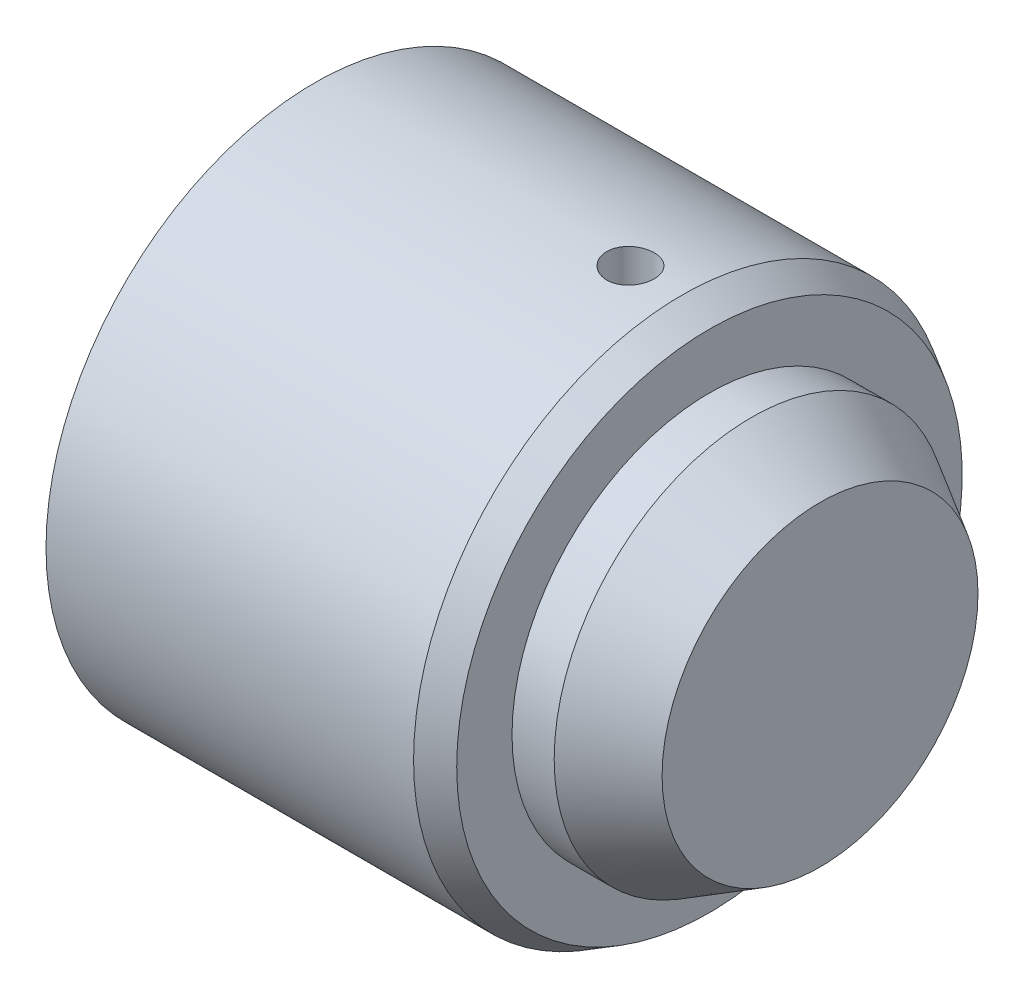
ISO-10303-21;
HEADER;
FILE_DESCRIPTION(('STEP AP214'),'2;1');
FILE_NAME('part.step','',(''),(''),'','','');
FILE_SCHEMA(('AUTOMOTIVE_DESIGN { 1 0 10303 214 1 1 1 1 }'));
ENDSEC;
DATA;
#1=APPLICATION_CONTEXT('core data for automotive mechanical design processes');
#2=APPLICATION_PROTOCOL_DEFINITION('international standard','automotive_design',2000,#1);
#3=PRODUCT_CONTEXT('',#1,'mechanical');
#4=PRODUCT('Part','Part','',(#3));
#5=PRODUCT_RELATED_PRODUCT_CATEGORY('part','',(#4));
#6=PRODUCT_DEFINITION_FORMATION('','',#4);
#7=PRODUCT_DEFINITION_CONTEXT('part definition',#1,'design');
#8=PRODUCT_DEFINITION('design','',#6,#7);
#9=PRODUCT_DEFINITION_SHAPE('','',#8);
#10=(LENGTH_UNIT() NAMED_UNIT(*) SI_UNIT(.MILLI.,.METRE.));
#11=(NAMED_UNIT(*) PLANE_ANGLE_UNIT() SI_UNIT($,.RADIAN.));
#12=(NAMED_UNIT(*) SI_UNIT($,.STERADIAN.) SOLID_ANGLE_UNIT());
#13=UNCERTAINTY_MEASURE_WITH_UNIT(LENGTH_MEASURE(1.E-05),#10,'distance_accuracy_value','');
#14=(GEOMETRIC_REPRESENTATION_CONTEXT(3) GLOBAL_UNCERTAINTY_ASSIGNED_CONTEXT((#13)) GLOBAL_UNIT_ASSIGNED_CONTEXT((#10,
#11,#12)) REPRESENTATION_CONTEXT('',''));
#15=CARTESIAN_POINT('',(0.,0.,0.));
#16=DIRECTION('',(0.,0.,1.));
#17=DIRECTION('',(1.,0.,0.));
#18=AXIS2_PLACEMENT_3D('',#15,#16,#17);
#19=CARTESIAN_POINT('',(0.,0.,0.));
#20=DIRECTION('',(-1.,0.,0.));
#21=DIRECTION('',(0.,0.,1.));
#22=AXIS2_PLACEMENT_3D('',#19,#20,#21);
#23=PLANE('',#22);
#24=CARTESIAN_POINT('',(0.,0.,0.));
#25=DIRECTION('',(-1.,0.,0.));
#26=DIRECTION('',(0.,0.,1.));
#27=AXIS2_PLACEMENT_3D('',#24,#25,#26);
#28=CIRCLE('',#27,9.99999999999999);
#29=CARTESIAN_POINT('',(0.,0.,9.99999999999999));
#30=VERTEX_POINT('',#29);
#31=EDGE_CURVE('E104',#30,#30,#28,.F.);
#32=ORIENTED_EDGE('',*,*,#31,.T.);
#33=EDGE_LOOP('',(#32));
#34=FACE_BOUND('',#33,.T.);
#35=ADVANCED_FACE('F47',(#34),#23,.F.);
#36=CARTESIAN_POINT('',(-10.,0.,0.));
#37=DIRECTION('',(-1.,0.,0.));
#38=DIRECTION('',(0.,0.,1.));
#39=AXIS2_PLACEMENT_3D('',#36,#37,#38);
#40=CYLINDRICAL_SURFACE('',#39,12.5);
#41=CARTESIAN_POINT('',(-4.3301270189222,0.,0.));
#42=DIRECTION('',(-1.,0.,0.));
#43=DIRECTION('',(0.,0.,1.));
#44=AXIS2_PLACEMENT_3D('',#41,#42,#43);
#45=CIRCLE('',#44,12.5);
#46=CARTESIAN_POINT('',(-4.3301270189222,0.,12.5));
#47=VERTEX_POINT('',#46);
#48=EDGE_CURVE('E100',#47,#47,#45,.T.);
#49=ORIENTED_EDGE('',*,*,#48,.T.);
#50=EDGE_LOOP('',(#49));
#51=FACE_BOUND('',#50,.T.);
#52=CARTESIAN_POINT('',(-7.,0.,0.));
#53=DIRECTION('',(-1.,0.,0.));
#54=DIRECTION('',(0.,0.,1.));
#55=AXIS2_PLACEMENT_3D('',#52,#53,#54);
#56=CIRCLE('',#55,12.5);
#57=CARTESIAN_POINT('',(-7.,0.,12.5));
#58=VERTEX_POINT('',#57);
#59=EDGE_CURVE('E96',#58,#58,#56,.T.);
#60=ORIENTED_EDGE('',*,*,#59,.F.);
#61=EDGE_LOOP('',(#60));
#62=FACE_BOUND('',#61,.T.);
#63=ADVANCED_FACE('F154',(#51,#62),#40,.T.);
#64=CARTESIAN_POINT('',(-7.,12.5,0.));
#65=DIRECTION('',(-1.,0.,0.));
#66=DIRECTION('',(0.,0.,1.));
#67=AXIS2_PLACEMENT_3D('',#64,#65,#66);
#68=PLANE('',#67);
#69=CARTESIAN_POINT('',(-7.,0.,0.));
#70=DIRECTION('',(-1.,0.,0.));
#71=DIRECTION('',(0.,0.,1.));
#72=AXIS2_PLACEMENT_3D('',#69,#70,#71);
#73=CIRCLE('',#72,16.);
#74=CARTESIAN_POINT('',(-7.,0.,16.));
#75=VERTEX_POINT('',#74);
#76=EDGE_CURVE('E11',#75,#75,#73,.F.);
#77=ORIENTED_EDGE('',*,*,#76,.T.);
#78=EDGE_LOOP('',(#77));
#79=FACE_BOUND('',#78,.T.);
#80=ORIENTED_EDGE('',*,*,#59,.T.);
#81=EDGE_LOOP('',(#80));
#82=FACE_BOUND('',#81,.T.);
#83=ADVANCED_FACE('F149',(#79,#82),#68,.F.);
#84=CARTESIAN_POINT('',(-10.,0.,0.));
#85=DIRECTION('',(-1.,0.,0.));
#86=DIRECTION('',(0.,0.,1.));
#87=AXIS2_PLACEMENT_3D('',#84,#85,#86);
#88=CYLINDRICAL_SURFACE('',#87,17.);
#89=CARTESIAN_POINT('',(-12.,-16.9336942218761,1.5));
#90=CARTESIAN_POINT('',(-11.9159204825132,-16.9336950978004,1.49999633516772));
#91=CARTESIAN_POINT('',(-11.8317841778896,-16.9343271753964,1.49290684455629));
#92=CARTESIAN_POINT('',(-11.6658408210362,-16.9367870765352,1.46473062205643));
#93=CARTESIAN_POINT('',(-11.5840364961547,-16.9386162447077,1.44362814972226));
#94=CARTESIAN_POINT('',(-11.4251844522875,-16.9432615534383,1.3880421836027));
#95=CARTESIAN_POINT('',(-11.3481340149467,-16.9460771236862,1.35356642064934));
#96=CARTESIAN_POINT('',(-11.2009314140911,-16.9523772825804,1.27222657776627));
#97=CARTESIAN_POINT('',(-11.130777808918,-16.9558617309584,1.22536509443389));
#98=CARTESIAN_POINT('',(-10.9991416592004,-16.9631182231717,1.12043942591989));
#99=CARTESIAN_POINT('',(-10.9376815889941,-16.9668909749368,1.06234709155776));
#100=CARTESIAN_POINT('',(-10.8253703478861,-16.9742925141895,0.936668506914025));
#101=CARTESIAN_POINT('',(-10.7745196464366,-16.9779212953008,0.869081836740363));
#102=CARTESIAN_POINT('',(-10.6847948890886,-16.9846328283164,0.726197884312478));
#103=CARTESIAN_POINT('',(-10.6459404248648,-16.9877146835546,0.650888253654693));
#104=CARTESIAN_POINT('',(-10.5814363959711,-16.9929774708925,0.494782164211972));
#105=CARTESIAN_POINT('',(-10.5557865752385,-16.9951584204621,0.413985811859216));
#106=CARTESIAN_POINT('',(-10.5184850320794,-16.9983687081508,0.249424635325278));
#107=CARTESIAN_POINT('',(-10.5067967619858,-16.9994010525277,0.165668155079528));
#108=CARTESIAN_POINT('',(-10.4976370971062,-17.0002080114694,-0.00262369655283038));
#109=CARTESIAN_POINT('',(-10.5001654092043,-16.9999826519653,-0.0871590518448078));
#110=CARTESIAN_POINT('',(-10.5193373116254,-16.9983020697412,-0.254361112055097));
#111=CARTESIAN_POINT('',(-10.5359416011779,-16.996850271334,-0.33703236253217));
#112=CARTESIAN_POINT('',(-10.5827329823663,-16.9928840047154,-0.49840994217289));
#113=CARTESIAN_POINT('',(-10.6129202164291,-16.990369525361,-0.57711622975143));
#114=CARTESIAN_POINT('',(-10.6860641877804,-16.9845548345853,-0.728454436682548));
#115=CARTESIAN_POINT('',(-10.7290384683139,-16.9812535449424,-0.801077834022927));
#116=CARTESIAN_POINT('',(-10.8265239130691,-16.9742360741871,-0.938095742336102));
#117=CARTESIAN_POINT('',(-10.8810353400728,-16.9705198836253,-1.00249006582142));
#118=CARTESIAN_POINT('',(-11.0002690703821,-16.963075136917,-1.12145180709538));
#119=CARTESIAN_POINT('',(-11.0650255341855,-16.9593465817836,-1.17598499215033));
#120=CARTESIAN_POINT('',(-11.202792260004,-16.9523100454116,-1.27341183275852));
#121=CARTESIAN_POINT('',(-11.2758025300812,-16.9490020645838,-1.31630547694248));
#122=CARTESIAN_POINT('',(-11.4280290363941,-16.9431807009154,-1.38923465249915));
#123=CARTESIAN_POINT('',(-11.5072461730093,-16.9406674336247,-1.41926831427872));
#124=CARTESIAN_POINT('',(-11.6696258401683,-16.9367223668568,-1.46559915535104));
#125=CARTESIAN_POINT('',(-11.752788277515,-16.935290541847,-1.48189665895332));
#126=CARTESIAN_POINT('',(-11.9203980496509,-16.9336747078646,-1.50024902886287));
#127=CARTESIAN_POINT('',(-12.0048401140938,-16.9334865128484,-1.50235167540466));
#128=CARTESIAN_POINT('',(-12.1728754801241,-16.9343681999185,-1.49237989312936));
#129=CARTESIAN_POINT('',(-12.2564687905934,-16.935438068826,-1.48030561282259));
#130=CARTESIAN_POINT('',(-12.4202959936884,-16.9387115230059,-1.44236259353404));
#131=CARTESIAN_POINT('',(-12.5005351092375,-16.9409132688319,-1.41651623348173));
#132=CARTESIAN_POINT('',(-12.6555381718845,-16.9462008815372,-1.35178551464609));
#133=CARTESIAN_POINT('',(-12.7303020206761,-16.9492867642858,-1.31290092183672));
#134=CARTESIAN_POINT('',(-12.8724506874699,-16.9560050965297,-1.22307695789039));
#135=CARTESIAN_POINT('',(-12.9398153481048,-16.9596389780679,-1.17210579595232));
#136=CARTESIAN_POINT('',(-13.0650494881695,-16.9670390646845,-1.05960139547773));
#137=CARTESIAN_POINT('',(-13.122918784518,-16.9708052723126,-0.998067953335507));
#138=CARTESIAN_POINT('',(-13.2276830521384,-16.9780581685734,-0.865979004018037));
#139=CARTESIAN_POINT('',(-13.2745469445675,-16.9815440477653,-0.795398796569824));
#140=CARTESIAN_POINT('',(-13.3557566972373,-16.987831825963,-0.647342605038226));
#141=CARTESIAN_POINT('',(-13.3901026955234,-16.9906337325116,-0.569866697011302));
#142=CARTESIAN_POINT('',(-13.4452485253189,-16.9952341622274,-0.410328930966409));
#143=CARTESIAN_POINT('',(-13.4660674519345,-16.9970340992797,-0.328273715780132));
#144=CARTESIAN_POINT('',(-13.4936305505454,-16.9994335446732,-0.161815800666716));
#145=CARTESIAN_POINT('',(-13.5003750244516,-17.0000330787642,-0.0774131511337259));
#146=CARTESIAN_POINT('',(-13.4995940507413,-16.999964192552,0.0910377060386938));
#147=CARTESIAN_POINT('',(-13.4921169855256,-16.9993000712658,0.175086143969796));
#148=CARTESIAN_POINT('',(-13.4632062287244,-16.996786987409,0.340728453841884));
#149=CARTESIAN_POINT('',(-13.4417725201503,-16.9949380233962,0.422322322794937));
#150=CARTESIAN_POINT('',(-13.3855695166058,-16.990262623238,0.580741487336431));
#151=CARTESIAN_POINT('',(-13.3508012480439,-16.987436262328,0.657567149422048));
#152=CARTESIAN_POINT('',(-13.2689214734468,-16.9811219517135,0.804299076503763));
#153=CARTESIAN_POINT('',(-13.2218101284836,-16.9776340106426,0.874205431777546));
#154=CARTESIAN_POINT('',(-13.1163998279913,-16.9703736749572,1.00536214502652));
#155=CARTESIAN_POINT('',(-13.0580649796898,-16.9666003919726,1.06658360696092));
#156=CARTESIAN_POINT('',(-12.9319305607873,-16.9592022110052,1.17839250623034));
#157=CARTESIAN_POINT('',(-12.8641287074667,-16.9555773490836,1.22897737143577));
#158=CARTESIAN_POINT('',(-12.720837863555,-16.9488783909142,1.31815454706369));
#159=CARTESIAN_POINT('',(-12.645333364193,-16.9458054416475,1.35672200240458));
#160=CARTESIAN_POINT('',(-12.4889437300891,-16.9405721242147,1.42058163606436));
#161=CARTESIAN_POINT('',(-12.4080648692797,-16.9384107128703,1.44588899753132));
#162=CARTESIAN_POINT('',(-12.2722616773835,-16.9357981080893,1.47610149832787));
#163=CARTESIAN_POINT('',(-12.2182093989146,-16.9350128060831,1.48505143183308));
#164=CARTESIAN_POINT('',(-12.1094461008919,-16.9339605786653,1.4970018663906));
#165=CARTESIAN_POINT('',(-12.0547350833686,-16.9336936516565,1.50000238577607));
#166=CARTESIAN_POINT('',(-12.,-16.9336942218761,1.5));
#167=B_SPLINE_CURVE_WITH_KNOTS('',3,(#89,#90,#91,#92,#93,#94,#95,#96,#97,#98,#99,#100,#101,#102,
#103,#104,#105,#106,#107,#108,#109,#110,#111,#112,#113,#114,#115,#116,#117,#118,#119,#120,#121,
#122,#123,#124,#125,#126,#127,#128,#129,#130,#131,#132,#133,#134,#135,#136,#137,#138,#139,#140,
#141,#142,#143,#144,#145,#146,#147,#148,#149,#150,#151,#152,#153,#154,#155,#156,#157,#158,#159,
#160,#161,#162,#163,#164,#165,#166),.UNSPECIFIED.,.T.,.F.,(4,2,2,2,2,2,2,2,2,2,2,2,2,2,2,2,2,2,
2,2,2,2,2,2,2,2,2,2,2,2,2,2,2,2,2,2,2,2,4),(0.,0.252038695018247,0.504360979031312,
0.756537617428056,1.00866143027265,1.26142556055625,1.51420087298959,1.76738684845994,
2.02056791399618,2.27308475540121,2.52559639046295,2.77740531479011,3.02921687957624,
3.28137552389821,3.53353991226425,3.78656354750224,4.03958742988799,4.2926480845817,
4.54570276436764,4.79790522937579,5.050105052462,5.30189630784819,5.55369208293146,
5.8061576395068,6.05862806332691,6.31180310345513,6.56497535152301,6.81778943524099,
7.0705980957909,7.32254822648263,7.57449866385936,7.82642971160526,8.07835747191914,
8.33110470711196,8.58391299124039,8.83724072926354,9.09027776311014,9.25435341324418,
9.41842855777743),.UNSPECIFIED.);
#168=CARTESIAN_POINT('',(-12.,-16.9336942218761,1.5));
#169=VERTEX_POINT('',#168);
#170=EDGE_CURVE('E140',#169,#169,#167,.T.);
#171=ORIENTED_EDGE('',*,*,#170,.T.);
#172=EDGE_LOOP('',(#171));
#173=FACE_BOUND('',#172,.T.);
#174=CARTESIAN_POINT('',(-12.,16.9336942218761,1.5));
#175=CARTESIAN_POINT('',(-12.0840795174868,16.9336950978004,1.49999633516772));
#176=CARTESIAN_POINT('',(-12.1682158221104,16.9343271753964,1.49290684455629));
#177=CARTESIAN_POINT('',(-12.3341591789638,16.9367870765352,1.46473062205643));
#178=CARTESIAN_POINT('',(-12.4159635038453,16.9386162447077,1.44362814972226));
#179=CARTESIAN_POINT('',(-12.5748155477125,16.9432615534383,1.3880421836027));
#180=CARTESIAN_POINT('',(-12.6518659850533,16.9460771236862,1.35356642064934));
#181=CARTESIAN_POINT('',(-12.7990685859089,16.9523772825804,1.27222657776627));
#182=CARTESIAN_POINT('',(-12.869222191082,16.9558617309584,1.22536509443389));
#183=CARTESIAN_POINT('',(-13.0008583407996,16.9631182231717,1.12043942591989));
#184=CARTESIAN_POINT('',(-13.0623184110059,16.9668909749368,1.06234709155776));
#185=CARTESIAN_POINT('',(-13.1746296521139,16.9742925141895,0.936668506914025));
#186=CARTESIAN_POINT('',(-13.2254803535634,16.9779212953008,0.869081836740362));
#187=CARTESIAN_POINT('',(-13.3152051109114,16.9846328283164,0.726197884312478));
#188=CARTESIAN_POINT('',(-13.3540595751352,16.9877146835546,0.650888253654693));
#189=CARTESIAN_POINT('',(-13.4185636040289,16.9929774708925,0.494782164211971));
#190=CARTESIAN_POINT('',(-13.4442134247615,16.9951584204621,0.413985811859216));
#191=CARTESIAN_POINT('',(-13.4815149679206,16.9983687081508,0.249424635325278));
#192=CARTESIAN_POINT('',(-13.4932032380142,16.9994010525277,0.165668155079528));
#193=CARTESIAN_POINT('',(-13.5023629028938,17.0002080114694,-0.00262369655283038));
#194=CARTESIAN_POINT('',(-13.4998345907957,16.9999826519653,-0.0871590518448078));
#195=CARTESIAN_POINT('',(-13.4806626883746,16.9983020697412,-0.254361112055097));
#196=CARTESIAN_POINT('',(-13.4640583988221,16.996850271334,-0.33703236253217));
#197=CARTESIAN_POINT('',(-13.4172670176337,16.9928840047154,-0.49840994217289));
#198=CARTESIAN_POINT('',(-13.3870797835709,16.990369525361,-0.57711622975143));
#199=CARTESIAN_POINT('',(-13.3139358122196,16.9845548345853,-0.728454436682548));
#200=CARTESIAN_POINT('',(-13.2709615316861,16.9812535449424,-0.801077834022927));
#201=CARTESIAN_POINT('',(-13.1734760869309,16.9742360741871,-0.938095742336102));
#202=CARTESIAN_POINT('',(-13.1189646599272,16.9705198836253,-1.00249006582142));
#203=CARTESIAN_POINT('',(-12.9997309296179,16.963075136917,-1.12145180709538));
#204=CARTESIAN_POINT('',(-12.9349744658145,16.9593465817836,-1.17598499215033));
#205=CARTESIAN_POINT('',(-12.797207739996,16.9523100454116,-1.27341183275852));
#206=CARTESIAN_POINT('',(-12.7241974699188,16.9490020645838,-1.31630547694248));
#207=CARTESIAN_POINT('',(-12.5719709636059,16.9431807009154,-1.38923465249915));
#208=CARTESIAN_POINT('',(-12.4927538269907,16.9406674336247,-1.41926831427872));
#209=CARTESIAN_POINT('',(-12.3303741598317,16.9367223668568,-1.46559915535104));
#210=CARTESIAN_POINT('',(-12.247211722485,16.935290541847,-1.48189665895332));
#211=CARTESIAN_POINT('',(-12.0796019503491,16.9336747078646,-1.50024902886287));
#212=CARTESIAN_POINT('',(-11.9951598859062,16.9334865128484,-1.50235167540466));
#213=CARTESIAN_POINT('',(-11.8271245198759,16.9343681999185,-1.49237989312936));
#214=CARTESIAN_POINT('',(-11.7435312094066,16.935438068826,-1.48030561282259));
#215=CARTESIAN_POINT('',(-11.5797040063116,16.9387115230059,-1.44236259353404));
#216=CARTESIAN_POINT('',(-11.4994648907625,16.9409132688319,-1.41651623348173));
#217=CARTESIAN_POINT('',(-11.3444618281155,16.9462008815372,-1.35178551464609));
#218=CARTESIAN_POINT('',(-11.2696979793239,16.9492867642858,-1.31290092183672));
#219=CARTESIAN_POINT('',(-11.1275493125301,16.9560050965297,-1.22307695789039));
#220=CARTESIAN_POINT('',(-11.0601846518952,16.9596389780679,-1.17210579595232));
#221=CARTESIAN_POINT('',(-10.9349505118305,16.9670390646845,-1.05960139547773));
#222=CARTESIAN_POINT('',(-10.877081215482,16.9708052723126,-0.998067953335507));
#223=CARTESIAN_POINT('',(-10.7723169478616,16.9780581685734,-0.865979004018037));
#224=CARTESIAN_POINT('',(-10.7254530554325,16.9815440477653,-0.795398796569824));
#225=CARTESIAN_POINT('',(-10.6442433027627,16.987831825963,-0.647342605038226));
#226=CARTESIAN_POINT('',(-10.6098973044766,16.9906337325116,-0.569866697011302));
#227=CARTESIAN_POINT('',(-10.5547514746811,16.9952341622274,-0.410328930966409));
#228=CARTESIAN_POINT('',(-10.5339325480655,16.9970340992797,-0.328273715780132));
#229=CARTESIAN_POINT('',(-10.5063694494546,16.9994335446732,-0.161815800666716));
#230=CARTESIAN_POINT('',(-10.4996249755484,17.0000330787642,-0.0774131511337259));
#231=CARTESIAN_POINT('',(-10.5004059492587,16.999964192552,0.0910377060386938));
#232=CARTESIAN_POINT('',(-10.5078830144744,16.9993000712658,0.175086143969796));
#233=CARTESIAN_POINT('',(-10.5367937712756,16.996786987409,0.340728453841884));
#234=CARTESIAN_POINT('',(-10.5582274798497,16.9949380233962,0.422322322794937));
#235=CARTESIAN_POINT('',(-10.6144304833942,16.990262623238,0.580741487336431));
#236=CARTESIAN_POINT('',(-10.6491987519561,16.987436262328,0.657567149422048));
#237=CARTESIAN_POINT('',(-10.7310785265532,16.9811219517135,0.804299076503763));
#238=CARTESIAN_POINT('',(-10.7781898715164,16.9776340106426,0.874205431777546));
#239=CARTESIAN_POINT('',(-10.8836001720087,16.9703736749572,1.00536214502652));
#240=CARTESIAN_POINT('',(-10.9419350203102,16.9666003919726,1.06658360696092));
#241=CARTESIAN_POINT('',(-11.0680694392127,16.9592022110052,1.17839250623034));
#242=CARTESIAN_POINT('',(-11.1358712925333,16.9555773490836,1.22897737143577));
#243=CARTESIAN_POINT('',(-11.279162136445,16.9488783909142,1.31815454706369));
#244=CARTESIAN_POINT('',(-11.354666635807,16.9458054416475,1.35672200240458));
#245=CARTESIAN_POINT('',(-11.5110562699109,16.9405721242147,1.42058163606436));
#246=CARTESIAN_POINT('',(-11.5919351307203,16.9384107128703,1.44588899753132));
#247=CARTESIAN_POINT('',(-11.7277383226165,16.9357981080893,1.47610149832787));
#248=CARTESIAN_POINT('',(-11.7817906010854,16.9350128060831,1.48505143183308));
#249=CARTESIAN_POINT('',(-11.8905538991081,16.9339605786653,1.4970018663906));
#250=CARTESIAN_POINT('',(-11.9452649166314,16.9336936516565,1.50000238577607));
#251=CARTESIAN_POINT('',(-12.,16.9336942218761,1.5));
#252=B_SPLINE_CURVE_WITH_KNOTS('',3,(#174,#175,#176,#177,#178,#179,#180,#181,#182,#183,#184,
#185,#186,#187,#188,#189,#190,#191,#192,#193,#194,#195,#196,#197,#198,#199,#200,#201,#202,#203,
#204,#205,#206,#207,#208,#209,#210,#211,#212,#213,#214,#215,#216,#217,#218,#219,#220,#221,#222,
#223,#224,#225,#226,#227,#228,#229,#230,#231,#232,#233,#234,#235,#236,#237,#238,#239,#240,#241,
#242,#243,#244,#245,#246,#247,#248,#249,#250,#251),.UNSPECIFIED.,.T.,.F.,(4,2,2,2,2,2,2,2,2,2,2,
2,2,2,2,2,2,2,2,2,2,2,2,2,2,2,2,2,2,2,2,2,2,2,2,2,2,2,4),(0.,0.252038695018247,
0.504360979031312,0.756537617428056,1.00866143027265,1.26142556055625,1.51420087298959,
1.76738684845994,2.02056791399618,2.27308475540121,2.52559639046295,2.77740531479011,
3.02921687957624,3.28137552389821,3.53353991226425,3.78656354750224,4.03958742988799,
4.2926480845817,4.54570276436764,4.79790522937579,5.050105052462,5.30189630784819,
5.55369208293146,5.8061576395068,6.05862806332691,6.31180310345513,6.56497535152301,
6.81778943524099,7.0705980957909,7.32254822648263,7.57449866385936,7.82642971160526,
8.07835747191914,8.33110470711196,8.58391299124039,8.83724072926354,9.09027776311014,
9.25435341324418,9.41842855777743),.UNSPECIFIED.);
#253=CARTESIAN_POINT('',(-12.,16.9336942218761,1.5));
#254=VERTEX_POINT('',#253);
#255=EDGE_CURVE('E133',#254,#254,#252,.T.);
#256=ORIENTED_EDGE('',*,*,#255,.T.);
#257=EDGE_LOOP('',(#256));
#258=FACE_BOUND('',#257,.T.);
#259=CARTESIAN_POINT('',(-8.73205080756888,0.,0.));
#260=DIRECTION('',(-1.,0.,0.));
#261=DIRECTION('',(0.,0.,1.));
#262=AXIS2_PLACEMENT_3D('',#259,#260,#261);
#263=CIRCLE('',#262,17.);
#264=CARTESIAN_POINT('',(-8.73205080756888,0.,17.));
#265=VERTEX_POINT('',#264);
#266=EDGE_CURVE('E62',#265,#265,#263,.T.);
#267=ORIENTED_EDGE('',*,*,#266,.T.);
#268=EDGE_LOOP('',(#267));
#269=FACE_BOUND('',#268,.T.);
#270=CARTESIAN_POINT('',(-32.,0.,0.));
#271=DIRECTION('',(-1.,0.,0.));
#272=DIRECTION('',(0.,0.,1.));
#273=AXIS2_PLACEMENT_3D('',#270,#271,#272);
#274=CIRCLE('',#273,17.);
#275=CARTESIAN_POINT('',(-32.,0.,17.));
#276=VERTEX_POINT('',#275);
#277=EDGE_CURVE('E92',#276,#276,#274,.T.);
#278=ORIENTED_EDGE('',*,*,#277,.F.);
#279=EDGE_LOOP('',(#278));
#280=FACE_BOUND('',#279,.T.);
#281=ADVANCED_FACE('F144',(#173,#258,#269,#280),#88,.T.);
#282=CARTESIAN_POINT('',(-32.,17.,0.));
#283=DIRECTION('',(1.,0.,0.));
#284=DIRECTION('',(0.,0.,-1.));
#285=AXIS2_PLACEMENT_3D('',#282,#283,#284);
#286=PLANE('',#285);
#287=CARTESIAN_POINT('',(-32.,0.,0.));
#288=DIRECTION('',(-1.,0.,0.));
#289=DIRECTION('',(0.,0.,1.));
#290=AXIS2_PLACEMENT_3D('',#287,#288,#289);
#291=CIRCLE('',#290,14.);
#292=CARTESIAN_POINT('',(-32.,0.,14.));
#293=VERTEX_POINT('',#292);
#294=EDGE_CURVE('E82',#293,#293,#291,.T.);
#295=ORIENTED_EDGE('',*,*,#294,.F.);
#296=EDGE_LOOP('',(#295));
#297=FACE_BOUND('',#296,.T.);
#298=ORIENTED_EDGE('',*,*,#277,.T.);
#299=EDGE_LOOP('',(#298));
#300=FACE_BOUND('',#299,.T.);
#301=ADVANCED_FACE('F148',(#297,#300),#286,.F.);
#302=CARTESIAN_POINT('',(-10.,0.,0.));
#303=DIRECTION('',(-1.,0.,0.));
#304=DIRECTION('',(0.,0.,1.));
#305=AXIS2_PLACEMENT_3D('',#302,#303,#304);
#306=CYLINDRICAL_SURFACE('',#305,14.);
#307=CARTESIAN_POINT('',(-12.,-13.9194109070751,1.5));
#308=CARTESIAN_POINT('',(-12.0839958082718,-13.9194119572178,1.49999637790849));
#309=CARTESIAN_POINT('',(-12.1680463562242,-13.9201794062857,1.49292093045989));
#310=CARTESIAN_POINT('',(-12.3338148062416,-13.923165663132,1.46480376899872));
#311=CARTESIAN_POINT('',(-12.4155300718535,-13.9253860485269,1.44374687338791));
#312=CARTESIAN_POINT('',(-12.5742035149213,-13.9310238524709,1.38828904327732));
#313=CARTESIAN_POINT('',(-12.6511646321476,-13.9344405223908,1.35389645274876));
#314=CARTESIAN_POINT('',(-12.7982061270279,-13.9420850071975,1.27276005356358));
#315=CARTESIAN_POINT('',(-12.8682878174567,-13.9463126668696,1.22601860770072));
#316=CARTESIAN_POINT('',(-12.9998880870434,-13.9551224412933,1.12130303257902));
#317=CARTESIAN_POINT('',(-13.06137404725,-13.9597058087989,1.06328801102761));
#318=CARTESIAN_POINT('',(-13.1737563643558,-13.9686992291172,0.937759725321593));
#319=CARTESIAN_POINT('',(-13.2246522258627,-13.9731092738142,0.870246017077083));
#320=CARTESIAN_POINT('',(-13.3145236646957,-13.9812716736442,0.727435376746561));
#321=CARTESIAN_POINT('',(-13.3534701715878,-13.9850224155117,0.652120050443116));
#322=CARTESIAN_POINT('',(-13.4181513239089,-13.9914299277732,0.495971533764521));
#323=CARTESIAN_POINT('',(-13.4438863355097,-13.9940867284868,0.415138496389522));
#324=CARTESIAN_POINT('',(-13.4813177531919,-13.9979982060385,0.250580022201048));
#325=CARTESIAN_POINT('',(-13.4930679490467,-13.9992582539121,0.166866950414402));
#326=CARTESIAN_POINT('',(-13.5023626964428,-14.000252540958,-0.00135185114797908));
#327=CARTESIAN_POINT('',(-13.4999076665701,-13.9999868250901,-0.0858575574938544));
#328=CARTESIAN_POINT('',(-13.4809051683702,-13.9979639059307,-0.252897455974469));
#329=CARTESIAN_POINT('',(-13.464415542238,-13.9962128245251,-0.335438312763004));
#330=CARTESIAN_POINT('',(-13.4179021234662,-13.9914229299824,-0.496574231600791));
#331=CARTESIAN_POINT('',(-13.3878781329549,-13.9883840980186,-0.57516923594325));
#332=CARTESIAN_POINT('',(-13.3150853397981,-13.9813497504685,-0.726363896175799));
#333=CARTESIAN_POINT('',(-13.2722910901195,-13.9773523278718,-0.798951208249208));
#334=CARTESIAN_POINT('',(-13.1751910351731,-13.9688490017733,-0.935935314381969));
#335=CARTESIAN_POINT('',(-13.1208848420445,-13.9643430811415,-1.00033183235972));
#336=CARTESIAN_POINT('',(-13.0019774964231,-13.9553013382367,-1.11944543584154));
#337=CARTESIAN_POINT('',(-12.937326001219,-13.9507654794566,-1.17411227541631));
#338=CARTESIAN_POINT('',(-12.7997373877806,-13.9421975977028,-1.27182533265911));
#339=CARTESIAN_POINT('',(-12.7268002544161,-13.9381655756491,-1.31487152910624));
#340=CARTESIAN_POINT('',(-12.5746705505781,-13.9310616518798,-1.38812194925369));
#341=CARTESIAN_POINT('',(-12.4954763567294,-13.9279900003608,-1.41832282721614));
#342=CARTESIAN_POINT('',(-12.3331007415951,-13.923159706957,-1.46498430040181));
#343=CARTESIAN_POINT('',(-12.2499194603105,-13.9214010190053,-1.48144537770505));
#344=CARTESIAN_POINT('',(-12.0823726862536,-13.9194038882243,-1.50009484563834));
#345=CARTESIAN_POINT('',(-11.9980151158519,-13.9191579465341,-1.50235363989616));
#346=CARTESIAN_POINT('',(-11.8301227052991,-13.9201943559554,-1.49271954643616));
#347=CARTESIAN_POINT('',(-11.7465878523733,-13.921476683299,-1.48082687880356));
#348=CARTESIAN_POINT('',(-11.5829188542441,-13.9254183184659,-1.44328645403506));
#349=CARTESIAN_POINT('',(-11.5027769374786,-13.9280742721431,-1.41767219709813));
#350=CARTESIAN_POINT('',(-11.3479267669972,-13.9344611829005,-1.35344996280734));
#351=CARTESIAN_POINT('',(-11.2732186555594,-13.9381921681163,-1.31484164536737));
#352=CARTESIAN_POINT('',(-11.1310365055208,-13.9463268604645,-1.22555173285179));
#353=CARTESIAN_POINT('',(-11.0635918344567,-13.9507331359743,-1.17482361160314));
#354=CARTESIAN_POINT('',(-10.9381493621395,-13.9597136223586,-1.06280052006878));
#355=CARTESIAN_POINT('',(-10.8801518297456,-13.9642878380082,-1.00150524915134));
#356=CARTESIAN_POINT('',(-10.7750059916055,-13.9731115529405,-0.869781814819257));
#357=CARTESIAN_POINT('',(-10.7279037027106,-13.9773596260725,-0.799316810355234));
#358=CARTESIAN_POINT('',(-10.6462025266045,-13.9850315109083,-0.651435375612057));
#359=CARTESIAN_POINT('',(-10.6116034462489,-13.9884553353445,-0.574019052737079));
#360=CARTESIAN_POINT('',(-10.5559682800327,-13.994086542467,-0.414591135681013));
#361=CARTESIAN_POINT('',(-10.5349047179358,-13.9962963881199,-0.33258922036258));
#362=CARTESIAN_POINT('',(-10.5068489039392,-13.9992607885866,-0.16618764993489));
#363=CARTESIAN_POINT('',(-10.499856193866,-14.0000153907857,-0.0817880729887804));
#364=CARTESIAN_POINT('',(-10.5001475749224,-13.9999842053307,0.0865617548742788));
#365=CARTESIAN_POINT('',(-10.5073603586337,-13.9992061113591,0.170512139699058));
#366=CARTESIAN_POINT('',(-10.535708060321,-13.9962121633387,0.336001063502533));
#367=CARTESIAN_POINT('',(-10.5568429845309,-13.9939963086461,0.417539601401258));
#368=CARTESIAN_POINT('',(-10.6124145468771,-13.9883749797482,0.575887334320121));
#369=CARTESIAN_POINT('',(-10.646848738253,-13.9849697243763,0.652697396259573));
#370=CARTESIAN_POINT('',(-10.728033884039,-13.9773485137443,0.79945919077099));
#371=CARTESIAN_POINT('',(-10.7747848247953,-13.9731325593828,0.869410930945676));
#372=CARTESIAN_POINT('',(-10.8795430348144,-13.9643365063724,1.00083567707109));
#373=CARTESIAN_POINT('',(-10.9376034332812,-13.9597547516974,1.06226622439511));
#374=CARTESIAN_POINT('',(-11.0632255123826,-13.950757334422,1.17454290815384));
#375=CARTESIAN_POINT('',(-11.1307894609492,-13.9463417117874,1.22538651090995));
#376=CARTESIAN_POINT('',(-11.2737171520071,-13.9381629302096,1.31516479258672));
#377=CARTESIAN_POINT('',(-11.3491027932371,-13.9344016865968,1.35406475911253));
#378=CARTESIAN_POINT('',(-11.5053298979875,-13.9279802013449,1.41860102800187));
#379=CARTESIAN_POINT('',(-11.5861651505048,-13.9253187301522,1.44425215073791));
#380=CARTESIAN_POINT('',(-11.7228735108042,-13.922062801924,1.47523272696941));
#381=CARTESIAN_POINT('',(-11.7778754531532,-13.9210731090702,1.48450758946156));
#382=CARTESIAN_POINT('',(-11.8885769021388,-13.9197468149444,1.4968924119992));
#383=CARTESIAN_POINT('',(-11.9442764052794,-13.9194102104006,1.50000240292895));
#384=CARTESIAN_POINT('',(-12.,-13.9194109070751,1.5));
#385=B_SPLINE_CURVE_WITH_KNOTS('',3,(#307,#308,#309,#310,#311,#312,#313,#314,#315,#316,#317,
#318,#319,#320,#321,#322,#323,#324,#325,#326,#327,#328,#329,#330,#331,#332,#333,#334,#335,#336,
#337,#338,#339,#340,#341,#342,#343,#344,#345,#346,#347,#348,#349,#350,#351,#352,#353,#354,#355,
#356,#357,#358,#359,#360,#361,#362,#363,#364,#365,#366,#367,#368,#369,#370,#371,#372,#373,#374,
#375,#376,#377,#378,#379,#380,#381,#382,#383,#384),.UNSPECIFIED.,.T.,.F.,(4,2,2,2,2,2,2,2,2,2,2,
2,2,2,2,2,2,2,2,2,2,2,2,2,2,2,2,2,2,2,2,2,2,2,2,2,2,2,4),(0.,0.251783913330533,
0.503841671467261,0.755741974162376,1.00759411385449,1.26037744147798,1.51317259135175,
1.76657795292632,2.01997629069676,2.27239680021158,2.52480987167732,2.77618765734666,
3.02756911826312,3.27945488538695,3.53134914040661,3.78450869397511,4.0376687098446,
4.29089462436263,4.54411165372385,4.79607243820295,5.0480293042091,5.29937382188553,
5.55072491836985,5.80305687391892,6.05539600940942,6.30878221196359,6.5621645001445,
6.81503079998949,7.06788886589705,7.31948089314306,7.57107303304474,7.82261890778983,
8.07416450368323,8.32692161440708,8.57973914587836,8.83328464632587,9.08654590902362,
9.25358251859521,9.42061829135887),.UNSPECIFIED.);
#386=CARTESIAN_POINT('',(-12.,-13.9194109070751,1.5));
#387=VERTEX_POINT('',#386);
#388=EDGE_CURVE('E52',#387,#387,#385,.T.);
#389=ORIENTED_EDGE('',*,*,#388,.T.);
#390=EDGE_LOOP('',(#389));
#391=FACE_BOUND('',#390,.T.);
#392=CARTESIAN_POINT('',(-12.,13.9194109070751,1.5));
#393=CARTESIAN_POINT('',(-11.9160041917282,13.9194119572178,1.49999637790849));
#394=CARTESIAN_POINT('',(-11.8319536437758,13.9201794062857,1.49292093045989));
#395=CARTESIAN_POINT('',(-11.6661851937584,13.923165663132,1.46480376899872));
#396=CARTESIAN_POINT('',(-11.5844699281465,13.9253860485269,1.44374687338791));
#397=CARTESIAN_POINT('',(-11.4257964850787,13.9310238524709,1.38828904327732));
#398=CARTESIAN_POINT('',(-11.3488353678524,13.9344405223908,1.35389645274876));
#399=CARTESIAN_POINT('',(-11.2017938729721,13.9420850071975,1.27276005356358));
#400=CARTESIAN_POINT('',(-11.1317121825433,13.9463126668696,1.22601860770072));
#401=CARTESIAN_POINT('',(-11.0001119129566,13.9551224412933,1.12130303257902));
#402=CARTESIAN_POINT('',(-10.93862595275,13.9597058087989,1.06328801102761));
#403=CARTESIAN_POINT('',(-10.8262436356442,13.9686992291172,0.937759725321593));
#404=CARTESIAN_POINT('',(-10.7753477741373,13.9731092738142,0.870246017077083));
#405=CARTESIAN_POINT('',(-10.6854763353043,13.9812716736442,0.727435376746561));
#406=CARTESIAN_POINT('',(-10.6465298284122,13.9850224155117,0.652120050443116));
#407=CARTESIAN_POINT('',(-10.5818486760912,13.9914299277732,0.495971533764521));
#408=CARTESIAN_POINT('',(-10.5561136644903,13.9940867284868,0.415138496389522));
#409=CARTESIAN_POINT('',(-10.5186822468081,13.9979982060385,0.250580022201048));
#410=CARTESIAN_POINT('',(-10.5069320509533,13.9992582539121,0.166866950414402));
#411=CARTESIAN_POINT('',(-10.4976373035572,14.000252540958,-0.00135185114797908));
#412=CARTESIAN_POINT('',(-10.5000923334299,13.9999868250901,-0.0858575574938544));
#413=CARTESIAN_POINT('',(-10.5190948316298,13.9979639059307,-0.252897455974469));
#414=CARTESIAN_POINT('',(-10.535584457762,13.9962128245251,-0.335438312763004));
#415=CARTESIAN_POINT('',(-10.5820978765338,13.9914229299824,-0.496574231600791));
#416=CARTESIAN_POINT('',(-10.6121218670451,13.9883840980186,-0.57516923594325));
#417=CARTESIAN_POINT('',(-10.6849146602019,13.9813497504685,-0.726363896175799));
#418=CARTESIAN_POINT('',(-10.7277089098805,13.9773523278718,-0.798951208249208));
#419=CARTESIAN_POINT('',(-10.8248089648269,13.9688490017733,-0.935935314381969));
#420=CARTESIAN_POINT('',(-10.8791151579555,13.9643430811415,-1.00033183235972));
#421=CARTESIAN_POINT('',(-10.9980225035769,13.9553013382367,-1.11944543584154));
#422=CARTESIAN_POINT('',(-11.062673998781,13.9507654794566,-1.17411227541631));
#423=CARTESIAN_POINT('',(-11.2002626122194,13.9421975977028,-1.27182533265911));
#424=CARTESIAN_POINT('',(-11.2731997455839,13.9381655756491,-1.31487152910624));
#425=CARTESIAN_POINT('',(-11.4253294494219,13.9310616518798,-1.38812194925369));
#426=CARTESIAN_POINT('',(-11.5045236432706,13.9279900003608,-1.41832282721614));
#427=CARTESIAN_POINT('',(-11.6668992584049,13.923159706957,-1.46498430040181));
#428=CARTESIAN_POINT('',(-11.7500805396895,13.9214010190053,-1.48144537770505));
#429=CARTESIAN_POINT('',(-11.9176273137464,13.9194038882243,-1.50009484563834));
#430=CARTESIAN_POINT('',(-12.0019848841481,13.9191579465341,-1.50235363989616));
#431=CARTESIAN_POINT('',(-12.1698772947009,13.9201943559554,-1.49271954643616));
#432=CARTESIAN_POINT('',(-12.2534121476267,13.921476683299,-1.48082687880356));
#433=CARTESIAN_POINT('',(-12.4170811457559,13.9254183184659,-1.44328645403506));
#434=CARTESIAN_POINT('',(-12.4972230625214,13.9280742721431,-1.41767219709813));
#435=CARTESIAN_POINT('',(-12.6520732330028,13.9344611829005,-1.35344996280734));
#436=CARTESIAN_POINT('',(-12.7267813444406,13.9381921681163,-1.31484164536737));
#437=CARTESIAN_POINT('',(-12.8689634944792,13.9463268604645,-1.22555173285179));
#438=CARTESIAN_POINT('',(-12.9364081655433,13.9507331359743,-1.17482361160314));
#439=CARTESIAN_POINT('',(-13.0618506378605,13.9597136223586,-1.06280052006878));
#440=CARTESIAN_POINT('',(-13.1198481702545,13.9642878380082,-1.00150524915134));
#441=CARTESIAN_POINT('',(-13.2249940083945,13.9731115529405,-0.869781814819257));
#442=CARTESIAN_POINT('',(-13.2720962972894,13.9773596260725,-0.799316810355233));
#443=CARTESIAN_POINT('',(-13.3537974733955,13.9850315109083,-0.651435375612056));
#444=CARTESIAN_POINT('',(-13.3883965537511,13.9884553353445,-0.574019052737078));
#445=CARTESIAN_POINT('',(-13.4440317199673,13.994086542467,-0.414591135681013));
#446=CARTESIAN_POINT('',(-13.4650952820642,13.9962963881199,-0.33258922036258));
#447=CARTESIAN_POINT('',(-13.4931510960608,13.9992607885866,-0.16618764993489));
#448=CARTESIAN_POINT('',(-13.500143806134,14.0000153907857,-0.0817880729887804));
#449=CARTESIAN_POINT('',(-13.4998524250776,13.9999842053307,0.0865617548742788));
#450=CARTESIAN_POINT('',(-13.4926396413663,13.9992061113591,0.170512139699058));
#451=CARTESIAN_POINT('',(-13.464291939679,13.9962121633387,0.336001063502533));
#452=CARTESIAN_POINT('',(-13.4431570154691,13.9939963086461,0.417539601401258));
#453=CARTESIAN_POINT('',(-13.3875854531229,13.9883749797482,0.57588733432012));
#454=CARTESIAN_POINT('',(-13.353151261747,13.9849697243763,0.652697396259572));
#455=CARTESIAN_POINT('',(-13.271966115961,13.9773485137443,0.79945919077099));
#456=CARTESIAN_POINT('',(-13.2252151752047,13.9731325593828,0.869410930945675));
#457=CARTESIAN_POINT('',(-13.1204569651856,13.9643365063724,1.00083567707109));
#458=CARTESIAN_POINT('',(-13.0623965667188,13.9597547516974,1.06226622439511));
#459=CARTESIAN_POINT('',(-12.9367744876174,13.950757334422,1.17454290815384));
#460=CARTESIAN_POINT('',(-12.8692105390508,13.9463417117874,1.22538651090995));
#461=CARTESIAN_POINT('',(-12.7262828479929,13.9381629302096,1.31516479258672));
#462=CARTESIAN_POINT('',(-12.6508972067629,13.9344016865968,1.35406475911253));
#463=CARTESIAN_POINT('',(-12.4946701020125,13.9279802013449,1.41860102800187));
#464=CARTESIAN_POINT('',(-12.4138348494952,13.9253187301522,1.44425215073791));
#465=CARTESIAN_POINT('',(-12.2771264891958,13.922062801924,1.47523272696941));
#466=CARTESIAN_POINT('',(-12.2221245468468,13.9210731090702,1.48450758946156));
#467=CARTESIAN_POINT('',(-12.1114230978612,13.9197468149444,1.4968924119992));
#468=CARTESIAN_POINT('',(-12.0557235947206,13.9194102104006,1.50000240292895));
#469=CARTESIAN_POINT('',(-12.,13.9194109070751,1.5));
#470=B_SPLINE_CURVE_WITH_KNOTS('',3,(#392,#393,#394,#395,#396,#397,#398,#399,#400,#401,#402,
#403,#404,#405,#406,#407,#408,#409,#410,#411,#412,#413,#414,#415,#416,#417,#418,#419,#420,#421,
#422,#423,#424,#425,#426,#427,#428,#429,#430,#431,#432,#433,#434,#435,#436,#437,#438,#439,#440,
#441,#442,#443,#444,#445,#446,#447,#448,#449,#450,#451,#452,#453,#454,#455,#456,#457,#458,#459,
#460,#461,#462,#463,#464,#465,#466,#467,#468,#469),.UNSPECIFIED.,.T.,.F.,(4,2,2,2,2,2,2,2,2,2,2,
2,2,2,2,2,2,2,2,2,2,2,2,2,2,2,2,2,2,2,2,2,2,2,2,2,2,2,4),(0.,0.251783913330533,
0.503841671467261,0.755741974162376,1.00759411385449,1.26037744147798,1.51317259135175,
1.76657795292632,2.01997629069676,2.27239680021158,2.52480987167732,2.77618765734666,
3.02756911826312,3.27945488538695,3.53134914040661,3.78450869397511,4.0376687098446,
4.29089462436263,4.54411165372385,4.79607243820295,5.0480293042091,5.29937382188553,
5.55072491836985,5.80305687391892,6.05539600940942,6.30878221196359,6.5621645001445,
6.81503079998949,7.06788886589705,7.31948089314306,7.57107303304474,7.82261890778983,
8.07416450368323,8.32692161440708,8.57973914587836,8.83328464632587,9.08654590902362,
9.25358251859521,9.42061829135887),.UNSPECIFIED.);
#471=CARTESIAN_POINT('',(-12.,13.9194109070751,1.5));
#472=VERTEX_POINT('',#471);
#473=EDGE_CURVE('E110',#472,#472,#470,.T.);
#474=ORIENTED_EDGE('',*,*,#473,.T.);
#475=EDGE_LOOP('',(#474));
#476=FACE_BOUND('',#475,.T.);
#477=CARTESIAN_POINT('',(-10.,0.,0.));
#478=DIRECTION('',(-1.,0.,0.));
#479=DIRECTION('',(0.,0.,1.));
#480=AXIS2_PLACEMENT_3D('',#477,#478,#479);
#481=CIRCLE('',#480,14.);
#482=CARTESIAN_POINT('',(-10.,0.,14.));
#483=VERTEX_POINT('',#482);
#484=EDGE_CURVE('E76',#483,#483,#481,.T.);
#485=ORIENTED_EDGE('',*,*,#484,.F.);
#486=EDGE_LOOP('',(#485));
#487=FACE_BOUND('',#486,.T.);
#488=ORIENTED_EDGE('',*,*,#294,.T.);
#489=EDGE_LOOP('',(#488));
#490=FACE_BOUND('',#489,.T.);
#491=ADVANCED_FACE('F116',(#391,#476,#487,#490),#306,.F.);
#492=CARTESIAN_POINT('',(-10.,14.,0.));
#493=DIRECTION('',(1.,0.,0.));
#494=DIRECTION('',(0.,0.,-1.));
#495=AXIS2_PLACEMENT_3D('',#492,#493,#494);
#496=PLANE('',#495);
#497=CARTESIAN_POINT('',(-10.,0.,0.));
#498=DIRECTION('',(-1.,0.,0.));
#499=DIRECTION('',(0.,0.,1.));
#500=AXIS2_PLACEMENT_3D('',#497,#498,#499);
#501=CIRCLE('',#500,4.);
#502=CARTESIAN_POINT('',(-10.,0.,4.));
#503=VERTEX_POINT('',#502);
#504=EDGE_CURVE('E85',#503,#503,#501,.T.);
#505=ORIENTED_EDGE('',*,*,#504,.F.);
#506=EDGE_LOOP('',(#505));
#507=FACE_BOUND('',#506,.T.);
#508=ORIENTED_EDGE('',*,*,#484,.T.);
#509=EDGE_LOOP('',(#508));
#510=FACE_BOUND('',#509,.T.);
#511=ADVANCED_FACE('F166',(#507,#510),#496,.F.);
#512=CARTESIAN_POINT('',(-4.3301270189222,0.,0.));
#513=DIRECTION('',(-1.,0.,0.));
#514=DIRECTION('',(0.,0.,1.));
#515=AXIS2_PLACEMENT_3D('',#512,#513,#514);
#516=CONICAL_SURFACE('',#515,12.5,0.5235987755983);
#517=ORIENTED_EDGE('',*,*,#31,.F.);
#518=EDGE_LOOP('',(#517));
#519=FACE_BOUND('',#518,.T.);
#520=ORIENTED_EDGE('',*,*,#48,.F.);
#521=EDGE_LOOP('',(#520));
#522=FACE_BOUND('',#521,.T.);
#523=ADVANCED_FACE('F162',(#519,#522),#516,.T.);
#524=CARTESIAN_POINT('',(-8.73205080756888,0.,0.));
#525=DIRECTION('',(-1.,0.,0.));
#526=DIRECTION('',(0.,0.,1.));
#527=AXIS2_PLACEMENT_3D('',#524,#525,#526);
#528=CONICAL_SURFACE('',#527,17.,0.523598775598299);
#529=ORIENTED_EDGE('',*,*,#76,.F.);
#530=EDGE_LOOP('',(#529));
#531=FACE_BOUND('',#530,.T.);
#532=ORIENTED_EDGE('',*,*,#266,.F.);
#533=EDGE_LOOP('',(#532));
#534=FACE_BOUND('',#533,.T.);
#535=ADVANCED_FACE('F50',(#531,#534),#528,.T.);
#536=CARTESIAN_POINT('',(-2.00000000000001,0.,0.));
#537=DIRECTION('',(-1.,0.,0.));
#538=DIRECTION('',(0.,0.,1.));
#539=AXIS2_PLACEMENT_3D('',#536,#537,#538);
#540=CONICAL_SURFACE('',#539,2.49999999999999,1.02974425867665);
#541=CARTESIAN_POINT('',(-0.4978484524311,0.,0.));
#542=VERTEX_POINT('',#541);
#543=VERTEX_LOOP('',#542);
#544=FACE_BOUND('',#543,.T.);
#545=CARTESIAN_POINT('',(-2.00000000000001,0.,0.));
#546=DIRECTION('',(-1.,0.,0.));
#547=DIRECTION('',(0.,0.,1.));
#548=AXIS2_PLACEMENT_3D('',#545,#546,#547);
#549=CIRCLE('',#548,2.49999999999999);
#550=CARTESIAN_POINT('',(-2.00000000000001,0.,2.49999999999999));
#551=VERTEX_POINT('',#550);
#552=EDGE_CURVE('E73',#551,#551,#549,.T.);
#553=ORIENTED_EDGE('',*,*,#552,.T.);
#554=EDGE_LOOP('',(#553));
#555=FACE_BOUND('',#554,.T.);
#556=ADVANCED_FACE('F66',(#544,#555),#540,.F.);
#557=CARTESIAN_POINT('',(-10.,0.,0.));
#558=DIRECTION('',(-1.,0.,0.));
#559=DIRECTION('',(0.,0.,1.));
#560=AXIS2_PLACEMENT_3D('',#557,#558,#559);
#561=CYLINDRICAL_SURFACE('',#560,2.49999999999999);
#562=ORIENTED_EDGE('',*,*,#552,.F.);
#563=EDGE_LOOP('',(#562));
#564=FACE_BOUND('',#563,.T.);
#565=CARTESIAN_POINT('',(-8.5,0.,0.));
#566=DIRECTION('',(-1.,0.,0.));
#567=DIRECTION('',(0.,0.,1.));
#568=AXIS2_PLACEMENT_3D('',#565,#566,#567);
#569=CIRCLE('',#568,2.5);
#570=CARTESIAN_POINT('',(-8.5,0.,2.5));
#571=VERTEX_POINT('',#570);
#572=EDGE_CURVE('E77',#571,#571,#569,.T.);
#573=ORIENTED_EDGE('',*,*,#572,.T.);
#574=EDGE_LOOP('',(#573));
#575=FACE_BOUND('',#574,.T.);
#576=ADVANCED_FACE('F69',(#564,#575),#561,.F.);
#577=CARTESIAN_POINT('',(-10.,0.,0.));
#578=DIRECTION('',(-1.,0.,0.));
#579=DIRECTION('',(0.,0.,1.));
#580=AXIS2_PLACEMENT_3D('',#577,#578,#579);
#581=CONICAL_SURFACE('',#580,4.,0.785398163397449);
#582=ORIENTED_EDGE('',*,*,#572,.F.);
#583=EDGE_LOOP('',(#582));
#584=FACE_BOUND('',#583,.T.);
#585=ORIENTED_EDGE('',*,*,#504,.T.);
#586=EDGE_LOOP('',(#585));
#587=FACE_BOUND('',#586,.T.);
#588=ADVANCED_FACE('F126',(#584,#587),#581,.F.);
#589=CARTESIAN_POINT('',(-12.,-20.,0.));
#590=DIRECTION('',(0.,1.,0.));
#591=DIRECTION('',(0.,0.,1.));
#592=AXIS2_PLACEMENT_3D('',#589,#590,#591);
#593=CYLINDRICAL_SURFACE('',#592,1.5);
#594=ORIENTED_EDGE('',*,*,#473,.F.);
#595=EDGE_LOOP('',(#594));
#596=FACE_BOUND('',#595,.T.);
#597=ORIENTED_EDGE('',*,*,#255,.F.);
#598=EDGE_LOOP('',(#597));
#599=FACE_BOUND('',#598,.T.);
#600=ADVANCED_FACE('F124',(#596,#599),#593,.F.);
#601=ORIENTED_EDGE('',*,*,#388,.F.);
#602=EDGE_LOOP('',(#601));
#603=FACE_BOUND('',#602,.T.);
#604=ORIENTED_EDGE('',*,*,#170,.F.);
#605=EDGE_LOOP('',(#604));
#606=FACE_BOUND('',#605,.T.);
#607=ADVANCED_FACE('F120',(#603,#606),#593,.F.);
#608=CLOSED_SHELL('',(#35,#63,#83,#281,#301,#491,#511,#523,#535,#556,#576,#588,#600,#607));
#609=MANIFOLD_SOLID_BREP('B2',#608);
#610=ADVANCED_BREP_SHAPE_REPRESENTATION('',(#18,#609),#14);
#611=SHAPE_DEFINITION_REPRESENTATION(#9,#610);
ENDSEC;
END-ISO-10303-21;
